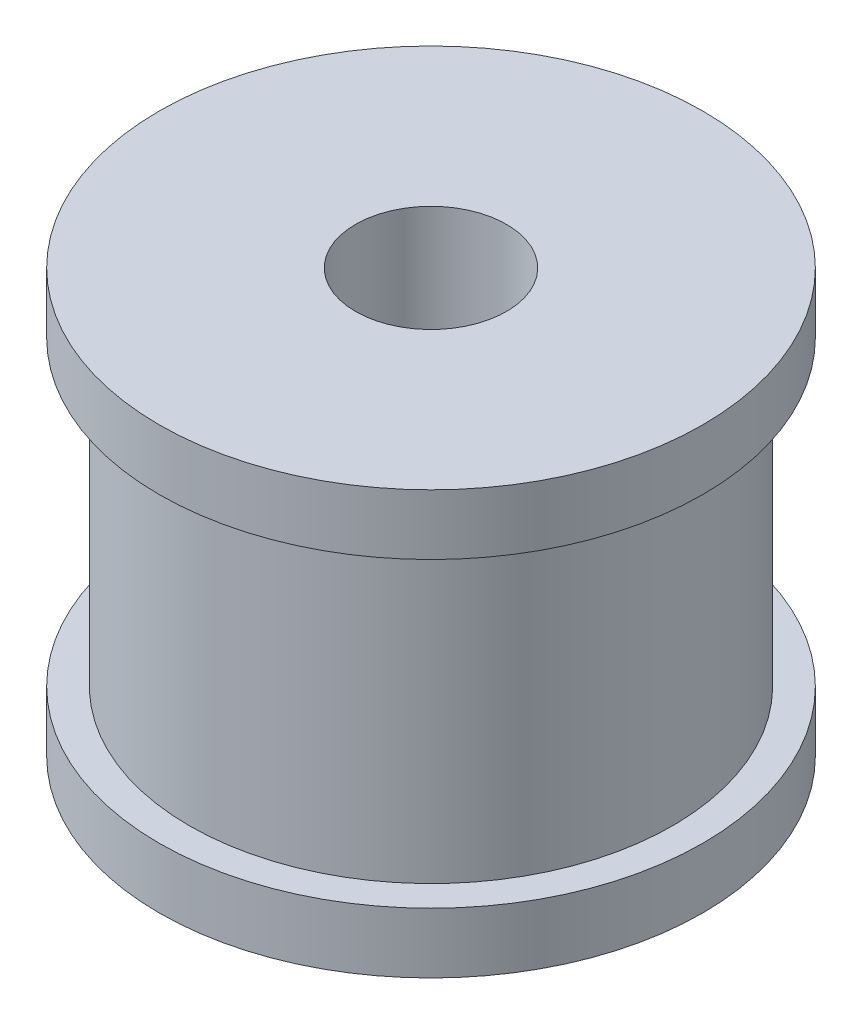
ISO-10303-21;
HEADER;
FILE_DESCRIPTION(('STEP AP214'),'2;1');
FILE_NAME('part.step','',(''),(''),'','','');
FILE_SCHEMA(('AUTOMOTIVE_DESIGN { 1 0 10303 214 1 1 1 1 }'));
ENDSEC;
DATA;
#1=APPLICATION_CONTEXT('core data for automotive mechanical design processes');
#2=APPLICATION_PROTOCOL_DEFINITION('international standard','automotive_design',2000,#1);
#3=PRODUCT_CONTEXT('',#1,'mechanical');
#4=PRODUCT('Part','Part','',(#3));
#5=PRODUCT_RELATED_PRODUCT_CATEGORY('part','',(#4));
#6=PRODUCT_DEFINITION_FORMATION('','',#4);
#7=PRODUCT_DEFINITION_CONTEXT('part definition',#1,'design');
#8=PRODUCT_DEFINITION('design','',#6,#7);
#9=PRODUCT_DEFINITION_SHAPE('','',#8);
#10=(LENGTH_UNIT() NAMED_UNIT(*) SI_UNIT(.MILLI.,.METRE.));
#11=(NAMED_UNIT(*) PLANE_ANGLE_UNIT() SI_UNIT($,.RADIAN.));
#12=(NAMED_UNIT(*) SI_UNIT($,.STERADIAN.) SOLID_ANGLE_UNIT());
#13=UNCERTAINTY_MEASURE_WITH_UNIT(LENGTH_MEASURE(1.E-05),#10,'distance_accuracy_value','');
#14=(GEOMETRIC_REPRESENTATION_CONTEXT(3) GLOBAL_UNCERTAINTY_ASSIGNED_CONTEXT((#13)) GLOBAL_UNIT_ASSIGNED_CONTEXT((#10,
#11,#12)) REPRESENTATION_CONTEXT('',''));
#15=CARTESIAN_POINT('',(0.,0.,0.));
#16=DIRECTION('',(0.,0.,1.));
#17=DIRECTION('',(1.,0.,0.));
#18=AXIS2_PLACEMENT_3D('',#15,#16,#17);
#19=CARTESIAN_POINT('',(0.,10.,0.));
#20=DIRECTION('',(0.,-1.,0.));
#21=DIRECTION('',(0.,0.,-1.));
#22=AXIS2_PLACEMENT_3D('',#19,#20,#21);
#23=CYLINDRICAL_SURFACE('',#22,2.5);
#24=CARTESIAN_POINT('',(0.,-2.,0.));
#25=DIRECTION('',(0.,1.,0.));
#26=DIRECTION('',(0.,0.,1.));
#27=AXIS2_PLACEMENT_3D('',#24,#25,#26);
#28=CIRCLE('',#27,2.5);
#29=CARTESIAN_POINT('',(0.,-2.,2.5));
#30=VERTEX_POINT('',#29);
#31=EDGE_CURVE('E49',#30,#30,#28,.T.);
#32=ORIENTED_EDGE('',*,*,#31,.F.);
#33=EDGE_LOOP('',(#32));
#34=FACE_BOUND('',#33,.T.);
#35=CARTESIAN_POINT('',(0.,12.,0.));
#36=DIRECTION('',(0.,1.,0.));
#37=DIRECTION('',(0.,0.,1.));
#38=AXIS2_PLACEMENT_3D('',#35,#36,#37);
#39=CIRCLE('',#38,2.5);
#40=CARTESIAN_POINT('',(0.,12.,2.5));
#41=VERTEX_POINT('',#40);
#42=EDGE_CURVE('E63',#41,#41,#39,.T.);
#43=ORIENTED_EDGE('',*,*,#42,.T.);
#44=EDGE_LOOP('',(#43));
#45=FACE_BOUND('',#44,.T.);
#46=ADVANCED_FACE('F39',(#34,#45),#23,.F.);
#47=CARTESIAN_POINT('',(0.,10.,0.));
#48=DIRECTION('',(0.,-1.,0.));
#49=DIRECTION('',(0.,0.,-1.));
#50=AXIS2_PLACEMENT_3D('',#47,#48,#49);
#51=CYLINDRICAL_SURFACE('',#50,8.);
#52=CARTESIAN_POINT('',(0.,10.,0.));
#53=DIRECTION('',(0.,1.,0.));
#54=DIRECTION('',(0.,0.,1.));
#55=AXIS2_PLACEMENT_3D('',#52,#53,#54);
#56=CIRCLE('',#55,8.);
#57=CARTESIAN_POINT('',(0.,10.,8.));
#58=VERTEX_POINT('',#57);
#59=EDGE_CURVE('E11',#58,#58,#56,.T.);
#60=ORIENTED_EDGE('',*,*,#59,.F.);
#61=EDGE_LOOP('',(#60));
#62=FACE_BOUND('',#61,.T.);
#63=CARTESIAN_POINT('',(0.,0.,0.));
#64=DIRECTION('',(0.,1.,0.));
#65=DIRECTION('',(0.,0.,1.));
#66=AXIS2_PLACEMENT_3D('',#63,#64,#65);
#67=CIRCLE('',#66,8.);
#68=CARTESIAN_POINT('',(0.,0.,8.));
#69=VERTEX_POINT('',#68);
#70=EDGE_CURVE('E42',#69,#69,#67,.T.);
#71=ORIENTED_EDGE('',*,*,#70,.T.);
#72=EDGE_LOOP('',(#71));
#73=FACE_BOUND('',#72,.T.);
#74=ADVANCED_FACE('F86',(#62,#73),#51,.T.);
#75=CARTESIAN_POINT('',(0.,-2.,0.));
#76=DIRECTION('',(0.,1.,0.));
#77=DIRECTION('',(0.,0.,1.));
#78=AXIS2_PLACEMENT_3D('',#75,#76,#77);
#79=CYLINDRICAL_SURFACE('',#78,9.);
#80=CARTESIAN_POINT('',(0.,-2.,0.));
#81=DIRECTION('',(0.,1.,0.));
#82=DIRECTION('',(0.,0.,1.));
#83=AXIS2_PLACEMENT_3D('',#80,#81,#82);
#84=CIRCLE('',#83,9.);
#85=CARTESIAN_POINT('',(0.,-2.,9.));
#86=VERTEX_POINT('',#85);
#87=EDGE_CURVE('E54',#86,#86,#84,.T.);
#88=ORIENTED_EDGE('',*,*,#87,.T.);
#89=EDGE_LOOP('',(#88));
#90=FACE_BOUND('',#89,.T.);
#91=CARTESIAN_POINT('',(0.,0.,0.));
#92=DIRECTION('',(0.,1.,0.));
#93=DIRECTION('',(0.,0.,1.));
#94=AXIS2_PLACEMENT_3D('',#91,#92,#93);
#95=CIRCLE('',#94,9.);
#96=CARTESIAN_POINT('',(0.,0.,9.));
#97=VERTEX_POINT('',#96);
#98=EDGE_CURVE('E51',#97,#97,#95,.T.);
#99=ORIENTED_EDGE('',*,*,#98,.F.);
#100=EDGE_LOOP('',(#99));
#101=FACE_BOUND('',#100,.T.);
#102=ADVANCED_FACE('F91',(#90,#101),#79,.T.);
#103=CARTESIAN_POINT('',(0.,-2.,0.));
#104=DIRECTION('',(0.,1.,0.));
#105=DIRECTION('',(0.,0.,1.));
#106=AXIS2_PLACEMENT_3D('',#103,#104,#105);
#107=PLANE('',#106);
#108=ORIENTED_EDGE('',*,*,#87,.F.);
#109=EDGE_LOOP('',(#108));
#110=FACE_BOUND('',#109,.T.);
#111=ORIENTED_EDGE('',*,*,#31,.T.);
#112=EDGE_LOOP('',(#111));
#113=FACE_BOUND('',#112,.T.);
#114=ADVANCED_FACE('F82',(#110,#113),#107,.F.);
#115=CARTESIAN_POINT('',(0.,0.,0.));
#116=DIRECTION('',(0.,1.,0.));
#117=DIRECTION('',(0.,0.,1.));
#118=AXIS2_PLACEMENT_3D('',#115,#116,#117);
#119=PLANE('',#118);
#120=ORIENTED_EDGE('',*,*,#70,.F.);
#121=EDGE_LOOP('',(#120));
#122=FACE_BOUND('',#121,.T.);
#123=ORIENTED_EDGE('',*,*,#98,.T.);
#124=EDGE_LOOP('',(#123));
#125=FACE_BOUND('',#124,.T.);
#126=ADVANCED_FACE('F73',(#122,#125),#119,.T.);
#127=CARTESIAN_POINT('',(0.,12.,0.));
#128=DIRECTION('',(0.,1.,0.));
#129=DIRECTION('',(0.,0.,1.));
#130=AXIS2_PLACEMENT_3D('',#127,#128,#129);
#131=PLANE('',#130);
#132=CARTESIAN_POINT('',(0.,12.,0.));
#133=DIRECTION('',(0.,1.,0.));
#134=DIRECTION('',(0.,0.,1.));
#135=AXIS2_PLACEMENT_3D('',#132,#133,#134);
#136=CIRCLE('',#135,9.);
#137=CARTESIAN_POINT('',(0.,12.,9.));
#138=VERTEX_POINT('',#137);
#139=EDGE_CURVE('E55',#138,#138,#136,.T.);
#140=ORIENTED_EDGE('',*,*,#139,.T.);
#141=EDGE_LOOP('',(#140));
#142=FACE_BOUND('',#141,.T.);
#143=ORIENTED_EDGE('',*,*,#42,.F.);
#144=EDGE_LOOP('',(#143));
#145=FACE_BOUND('',#144,.T.);
#146=ADVANCED_FACE('F70',(#142,#145),#131,.T.);
#147=CARTESIAN_POINT('',(0.,10.,0.));
#148=DIRECTION('',(0.,1.,0.));
#149=DIRECTION('',(0.,0.,1.));
#150=AXIS2_PLACEMENT_3D('',#147,#148,#149);
#151=PLANE('',#150);
#152=ORIENTED_EDGE('',*,*,#59,.T.);
#153=EDGE_LOOP('',(#152));
#154=FACE_BOUND('',#153,.T.);
#155=CARTESIAN_POINT('',(0.,10.,0.));
#156=DIRECTION('',(0.,1.,0.));
#157=DIRECTION('',(0.,0.,1.));
#158=AXIS2_PLACEMENT_3D('',#155,#156,#157);
#159=CIRCLE('',#158,9.);
#160=CARTESIAN_POINT('',(0.,10.,9.));
#161=VERTEX_POINT('',#160);
#162=EDGE_CURVE('E60',#161,#161,#159,.T.);
#163=ORIENTED_EDGE('',*,*,#162,.F.);
#164=EDGE_LOOP('',(#163));
#165=FACE_BOUND('',#164,.T.);
#166=ADVANCED_FACE('F72',(#154,#165),#151,.F.);
#167=CARTESIAN_POINT('',(0.,12.,0.));
#168=DIRECTION('',(0.,-1.,0.));
#169=DIRECTION('',(0.,0.,-1.));
#170=AXIS2_PLACEMENT_3D('',#167,#168,#169);
#171=CYLINDRICAL_SURFACE('',#170,9.);
#172=ORIENTED_EDGE('',*,*,#139,.F.);
#173=EDGE_LOOP('',(#172));
#174=FACE_BOUND('',#173,.T.);
#175=ORIENTED_EDGE('',*,*,#162,.T.);
#176=EDGE_LOOP('',(#175));
#177=FACE_BOUND('',#176,.T.);
#178=ADVANCED_FACE('F80',(#174,#177),#171,.T.);
#179=CLOSED_SHELL('',(#46,#74,#102,#114,#126,#146,#166,#178));
#180=MANIFOLD_SOLID_BREP('B2',#179);
#181=ADVANCED_BREP_SHAPE_REPRESENTATION('',(#18,#180),#14);
#182=SHAPE_DEFINITION_REPRESENTATION(#9,#181);
ENDSEC;
END-ISO-10303-21;
